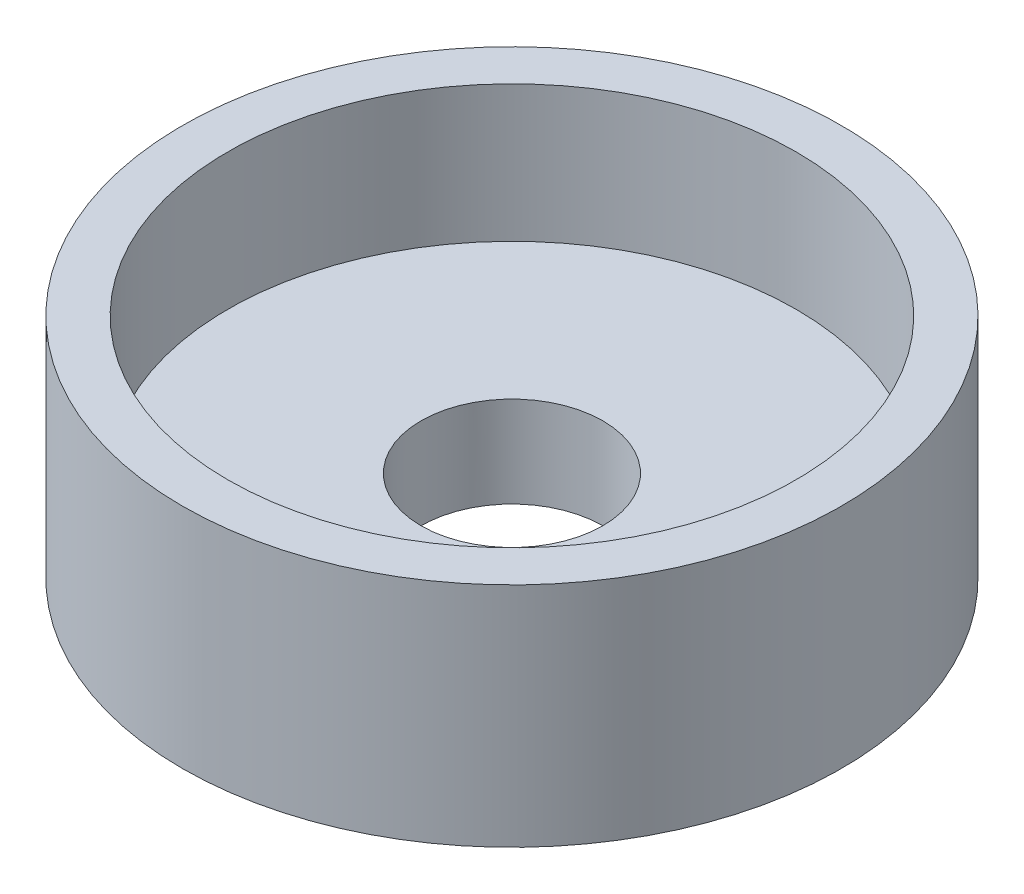
ISO-10303-21;
HEADER;
FILE_DESCRIPTION(('STEP AP214'),'2;1');
FILE_NAME('part.step','',(''),(''),'','','');
FILE_SCHEMA(('AUTOMOTIVE_DESIGN { 1 0 10303 214 1 1 1 1 }'));
ENDSEC;
DATA;
#1=APPLICATION_CONTEXT('core data for automotive mechanical design processes');
#2=APPLICATION_PROTOCOL_DEFINITION('international standard','automotive_design',2000,#1);
#3=PRODUCT_CONTEXT('',#1,'mechanical');
#4=PRODUCT('Part','Part','',(#3));
#5=PRODUCT_RELATED_PRODUCT_CATEGORY('part','',(#4));
#6=PRODUCT_DEFINITION_FORMATION('','',#4);
#7=PRODUCT_DEFINITION_CONTEXT('part definition',#1,'design');
#8=PRODUCT_DEFINITION('design','',#6,#7);
#9=PRODUCT_DEFINITION_SHAPE('','',#8);
#10=(LENGTH_UNIT() NAMED_UNIT(*) SI_UNIT(.MILLI.,.METRE.));
#11=(NAMED_UNIT(*) PLANE_ANGLE_UNIT() SI_UNIT($,.RADIAN.));
#12=(NAMED_UNIT(*) SI_UNIT($,.STERADIAN.) SOLID_ANGLE_UNIT());
#13=UNCERTAINTY_MEASURE_WITH_UNIT(LENGTH_MEASURE(1.E-05),#10,'distance_accuracy_value','');
#14=(GEOMETRIC_REPRESENTATION_CONTEXT(3) GLOBAL_UNCERTAINTY_ASSIGNED_CONTEXT((#13)) GLOBAL_UNIT_ASSIGNED_CONTEXT((#10,
#11,#12)) REPRESENTATION_CONTEXT('',''));
#15=CARTESIAN_POINT('',(0.,0.,0.));
#16=DIRECTION('',(0.,0.,1.));
#17=DIRECTION('',(1.,0.,0.));
#18=AXIS2_PLACEMENT_3D('',#15,#16,#17);
#19=CARTESIAN_POINT('',(0.,10.,0.));
#20=DIRECTION('',(0.,-1.,0.));
#21=DIRECTION('',(0.,0.,-1.));
#22=AXIS2_PLACEMENT_3D('',#19,#20,#21);
#23=CYLINDRICAL_SURFACE('',#22,14.5);
#24=CARTESIAN_POINT('',(0.,10.,0.));
#25=DIRECTION('',(0.,1.,0.));
#26=DIRECTION('',(0.,0.,1.));
#27=AXIS2_PLACEMENT_3D('',#24,#25,#26);
#28=CIRCLE('',#27,14.5);
#29=CARTESIAN_POINT('',(0.,10.,14.5));
#30=VERTEX_POINT('',#29);
#31=EDGE_CURVE('E10',#30,#30,#28,.T.);
#32=ORIENTED_EDGE('',*,*,#31,.F.);
#33=EDGE_LOOP('',(#32));
#34=FACE_BOUND('',#33,.T.);
#35=CARTESIAN_POINT('',(0.,0.,0.));
#36=DIRECTION('',(0.,1.,0.));
#37=DIRECTION('',(0.,0.,1.));
#38=AXIS2_PLACEMENT_3D('',#35,#36,#37);
#39=CIRCLE('',#38,14.5);
#40=CARTESIAN_POINT('',(0.,0.,14.5));
#41=VERTEX_POINT('',#40);
#42=EDGE_CURVE('E40',#41,#41,#39,.T.);
#43=ORIENTED_EDGE('',*,*,#42,.T.);
#44=EDGE_LOOP('',(#43));
#45=FACE_BOUND('',#44,.T.);
#46=ADVANCED_FACE('F33',(#34,#45),#23,.T.);
#47=CARTESIAN_POINT('',(0.,10.,0.));
#48=DIRECTION('',(0.,1.,0.));
#49=DIRECTION('',(0.,0.,1.));
#50=AXIS2_PLACEMENT_3D('',#47,#48,#49);
#51=PLANE('',#50);
#52=CARTESIAN_POINT('',(0.,10.,0.));
#53=DIRECTION('',(0.,1.,0.));
#54=DIRECTION('',(0.,0.,1.));
#55=AXIS2_PLACEMENT_3D('',#52,#53,#54);
#56=CIRCLE('',#55,12.5);
#57=CARTESIAN_POINT('',(0.,10.,12.5));
#58=VERTEX_POINT('',#57);
#59=EDGE_CURVE('E47',#58,#58,#56,.T.);
#60=ORIENTED_EDGE('',*,*,#59,.F.);
#61=EDGE_LOOP('',(#60));
#62=FACE_BOUND('',#61,.T.);
#63=ORIENTED_EDGE('',*,*,#31,.T.);
#64=EDGE_LOOP('',(#63));
#65=FACE_BOUND('',#64,.T.);
#66=ADVANCED_FACE('F74',(#62,#65),#51,.T.);
#67=CARTESIAN_POINT('',(0.,0.,0.));
#68=DIRECTION('',(0.,1.,0.));
#69=DIRECTION('',(0.,0.,1.));
#70=AXIS2_PLACEMENT_3D('',#67,#68,#69);
#71=PLANE('',#70);
#72=CARTESIAN_POINT('',(0.,0.,0.));
#73=DIRECTION('',(0.,-1.,0.));
#74=DIRECTION('',(0.,0.,-1.));
#75=AXIS2_PLACEMENT_3D('',#72,#73,#74);
#76=CIRCLE('',#75,4.);
#77=CARTESIAN_POINT('',(0.,0.,-4.));
#78=VERTEX_POINT('',#77);
#79=EDGE_CURVE('E52',#78,#78,#76,.T.);
#80=ORIENTED_EDGE('',*,*,#79,.F.);
#81=EDGE_LOOP('',(#80));
#82=FACE_BOUND('',#81,.T.);
#83=ORIENTED_EDGE('',*,*,#42,.F.);
#84=EDGE_LOOP('',(#83));
#85=FACE_BOUND('',#84,.T.);
#86=ADVANCED_FACE('F70',(#82,#85),#71,.F.);
#87=CARTESIAN_POINT('',(0.,4.,0.));
#88=DIRECTION('',(0.,1.,0.));
#89=DIRECTION('',(0.,0.,1.));
#90=AXIS2_PLACEMENT_3D('',#87,#88,#89);
#91=CYLINDRICAL_SURFACE('',#90,12.5);
#92=CARTESIAN_POINT('',(0.,4.,0.));
#93=DIRECTION('',(0.,1.,0.));
#94=DIRECTION('',(0.,0.,1.));
#95=AXIS2_PLACEMENT_3D('',#92,#93,#94);
#96=CIRCLE('',#95,12.5);
#97=CARTESIAN_POINT('',(0.,4.,12.5));
#98=VERTEX_POINT('',#97);
#99=EDGE_CURVE('E45',#98,#98,#96,.T.);
#100=ORIENTED_EDGE('',*,*,#99,.F.);
#101=EDGE_LOOP('',(#100));
#102=FACE_BOUND('',#101,.T.);
#103=ORIENTED_EDGE('',*,*,#59,.T.);
#104=EDGE_LOOP('',(#103));
#105=FACE_BOUND('',#104,.T.);
#106=ADVANCED_FACE('F64',(#102,#105),#91,.F.);
#107=CARTESIAN_POINT('',(0.,4.,0.));
#108=DIRECTION('',(0.,1.,0.));
#109=DIRECTION('',(0.,0.,1.));
#110=AXIS2_PLACEMENT_3D('',#107,#108,#109);
#111=PLANE('',#110);
#112=CARTESIAN_POINT('',(0.,4.,0.));
#113=DIRECTION('',(0.,1.,0.));
#114=DIRECTION('',(0.,0.,1.));
#115=AXIS2_PLACEMENT_3D('',#112,#113,#114);
#116=CIRCLE('',#115,4.);
#117=CARTESIAN_POINT('',(0.,4.,4.));
#118=VERTEX_POINT('',#117);
#119=EDGE_CURVE('E36',#118,#118,#116,.T.);
#120=ORIENTED_EDGE('',*,*,#119,.F.);
#121=EDGE_LOOP('',(#120));
#122=FACE_BOUND('',#121,.T.);
#123=ORIENTED_EDGE('',*,*,#99,.T.);
#124=EDGE_LOOP('',(#123));
#125=FACE_BOUND('',#124,.T.);
#126=ADVANCED_FACE('F61',(#122,#125),#111,.T.);
#127=CARTESIAN_POINT('',(0.,10.,0.));
#128=DIRECTION('',(0.,-1.,0.));
#129=DIRECTION('',(0.,0.,-1.));
#130=AXIS2_PLACEMENT_3D('',#127,#128,#129);
#131=CYLINDRICAL_SURFACE('',#130,4.);
#132=ORIENTED_EDGE('',*,*,#119,.T.);
#133=EDGE_LOOP('',(#132));
#134=FACE_BOUND('',#133,.T.);
#135=ORIENTED_EDGE('',*,*,#79,.T.);
#136=EDGE_LOOP('',(#135));
#137=FACE_BOUND('',#136,.T.);
#138=ADVANCED_FACE('F59',(#134,#137),#131,.F.);
#139=CLOSED_SHELL('',(#46,#66,#86,#106,#126,#138));
#140=MANIFOLD_SOLID_BREP('B2',#139);
#141=ADVANCED_BREP_SHAPE_REPRESENTATION('',(#18,#140),#14);
#142=SHAPE_DEFINITION_REPRESENTATION(#9,#141);
ENDSEC;
END-ISO-10303-21;
